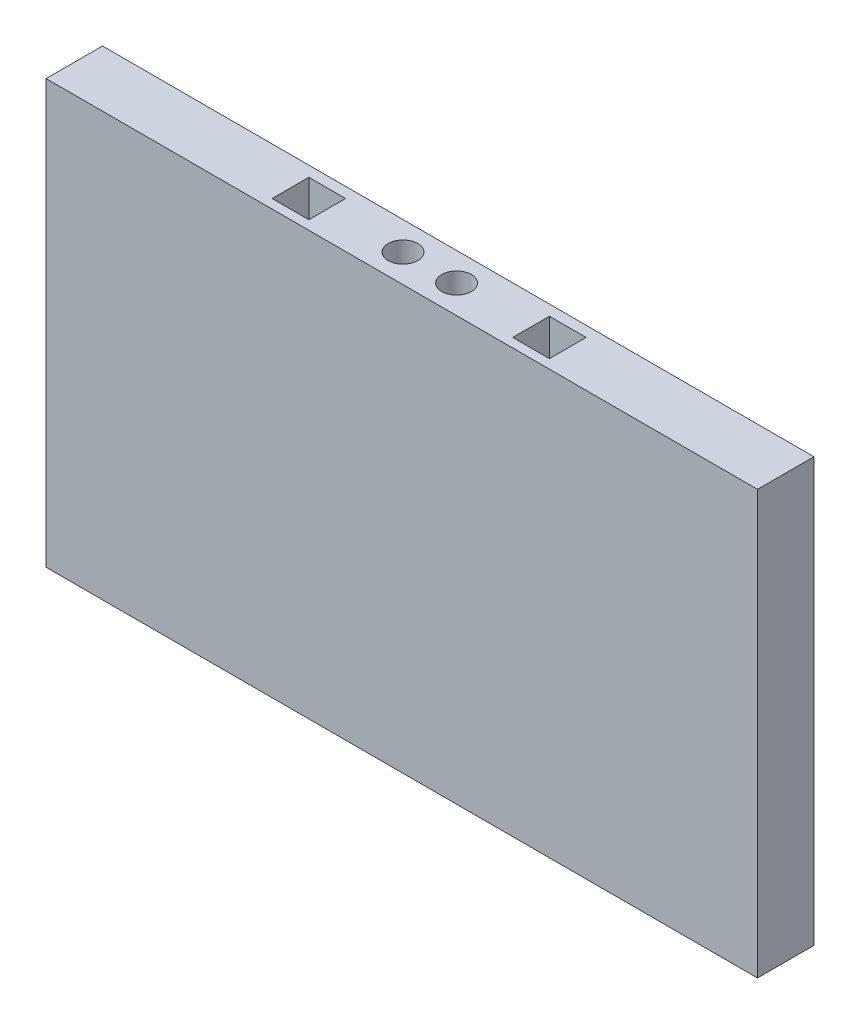
ISO-10303-21;
HEADER;
FILE_DESCRIPTION(('STEP AP214'),'2;1');
FILE_NAME('part.step','',(''),(''),'','','');
FILE_SCHEMA(('AUTOMOTIVE_DESIGN { 1 0 10303 214 1 1 1 1 }'));
ENDSEC;
DATA;
#1=APPLICATION_CONTEXT('core data for automotive mechanical design processes');
#2=APPLICATION_PROTOCOL_DEFINITION('international standard','automotive_design',2000,#1);
#3=PRODUCT_CONTEXT('',#1,'mechanical');
#4=PRODUCT('Part','Part','',(#3));
#5=PRODUCT_RELATED_PRODUCT_CATEGORY('part','',(#4));
#6=PRODUCT_DEFINITION_FORMATION('','',#4);
#7=PRODUCT_DEFINITION_CONTEXT('part definition',#1,'design');
#8=PRODUCT_DEFINITION('design','',#6,#7);
#9=PRODUCT_DEFINITION_SHAPE('','',#8);
#10=(LENGTH_UNIT() NAMED_UNIT(*) SI_UNIT(.MILLI.,.METRE.));
#11=(NAMED_UNIT(*) PLANE_ANGLE_UNIT() SI_UNIT($,.RADIAN.));
#12=(NAMED_UNIT(*) SI_UNIT($,.STERADIAN.) SOLID_ANGLE_UNIT());
#13=UNCERTAINTY_MEASURE_WITH_UNIT(LENGTH_MEASURE(1.E-05),#10,'distance_accuracy_value','');
#14=(GEOMETRIC_REPRESENTATION_CONTEXT(3) GLOBAL_UNCERTAINTY_ASSIGNED_CONTEXT((#13)) GLOBAL_UNIT_ASSIGNED_CONTEXT((#10,
#11,#12)) REPRESENTATION_CONTEXT('',''));
#15=CARTESIAN_POINT('',(0.,0.,0.));
#16=DIRECTION('',(0.,0.,1.));
#17=DIRECTION('',(1.,0.,0.));
#18=AXIS2_PLACEMENT_3D('',#15,#16,#17);
#19=CARTESIAN_POINT('',(-182.821386225128,92.090395480226,20.));
#20=DIRECTION('',(1.,0.,0.));
#21=DIRECTION('',(0.,0.,-1.));
#22=AXIS2_PLACEMENT_3D('',#19,#20,#21);
#23=PLANE('',#22);
#24=DIRECTION('',(0.,-1.,0.));
#25=VECTOR('',#24,1.);
#26=CARTESIAN_POINT('',(-182.821386225128,92.090395480226,0.));
#27=LINE('',#26,#25);
#28=CARTESIAN_POINT('',(-182.821386225128,92.090395480226,0.));
#29=VERTEX_POINT('',#28);
#30=CARTESIAN_POINT('',(-182.821386225128,-57.909604519774,0.));
#31=VERTEX_POINT('',#30);
#32=EDGE_CURVE('E217',#29,#31,#27,.T.);
#33=ORIENTED_EDGE('',*,*,#32,.T.);
#34=DIRECTION('',(0.,0.,1.));
#35=VECTOR('',#34,1.);
#36=CARTESIAN_POINT('',(-182.821386225128,-57.909604519774,-316.865902236261));
#37=LINE('',#36,#35);
#38=CARTESIAN_POINT('',(-182.821386225128,-57.909604519774,20.));
#39=VERTEX_POINT('',#38);
#40=EDGE_CURVE('E140',#31,#39,#37,.T.);
#41=ORIENTED_EDGE('',*,*,#40,.T.);
#42=DIRECTION('',(0.,-1.,0.));
#43=VECTOR('',#42,1.);
#44=CARTESIAN_POINT('',(-182.821386225128,92.090395480226,20.));
#45=LINE('',#44,#43);
#46=CARTESIAN_POINT('',(-182.821386225128,92.090395480226,20.));
#47=VERTEX_POINT('',#46);
#48=EDGE_CURVE('E39',#47,#39,#45,.T.);
#49=ORIENTED_EDGE('',*,*,#48,.F.);
#50=DIRECTION('',(0.,0.,-1.));
#51=VECTOR('',#50,1.);
#52=CARTESIAN_POINT('',(-182.821386225128,92.090395480226,20.));
#53=LINE('',#52,#51);
#54=EDGE_CURVE('E11',#47,#29,#53,.T.);
#55=ORIENTED_EDGE('',*,*,#54,.T.);
#56=EDGE_LOOP('',(#33,#41,#49,#55));
#57=FACE_BOUND('',#56,.T.);
#58=ADVANCED_FACE('F32',(#57),#23,.F.);
#59=CARTESIAN_POINT('',(-107.821386225128,92.090395480226,20.));
#60=DIRECTION('',(0.,-1.,0.));
#61=DIRECTION('',(1.,0.,0.));
#62=AXIS2_PLACEMENT_3D('',#59,#60,#61);
#63=PLANE('',#62);
#64=DIRECTION('',(-1.,0.,0.));
#65=VECTOR('',#64,1.);
#66=CARTESIAN_POINT('',(-7.66377731017402,92.090395480226,3.75));
#67=LINE('',#66,#65);
#68=CARTESIAN_POINT('',(-7.66377731017402,92.090395480226,3.75));
#69=VERTEX_POINT('',#68);
#70=CARTESIAN_POINT('',(-20.663777310174,92.090395480226,3.75));
#71=VERTEX_POINT('',#70);
#72=EDGE_CURVE('E142',#69,#71,#67,.T.);
#73=ORIENTED_EDGE('',*,*,#72,.F.);
#74=DIRECTION('',(0.,0.,-1.));
#75=VECTOR('',#74,1.);
#76=CARTESIAN_POINT('',(-7.66377731017402,92.090395480226,3.75));
#77=LINE('',#76,#75);
#78=CARTESIAN_POINT('',(-7.66377731017402,92.090395480226,16.75));
#79=VERTEX_POINT('',#78);
#80=EDGE_CURVE('E54',#79,#69,#77,.T.);
#81=ORIENTED_EDGE('',*,*,#80,.F.);
#82=DIRECTION('',(1.,0.,0.));
#83=VECTOR('',#82,1.);
#84=CARTESIAN_POINT('',(-7.66377731017402,92.090395480226,16.75));
#85=LINE('',#84,#83);
#86=CARTESIAN_POINT('',(-20.663777310174,92.090395480226,16.75));
#87=VERTEX_POINT('',#86);
#88=EDGE_CURVE('E151',#87,#79,#85,.T.);
#89=ORIENTED_EDGE('',*,*,#88,.F.);
#90=DIRECTION('',(0.,0.,1.));
#91=VECTOR('',#90,1.);
#92=CARTESIAN_POINT('',(-20.663777310174,92.090395480226,3.75));
#93=LINE('',#92,#91);
#94=EDGE_CURVE('E163',#71,#87,#93,.T.);
#95=ORIENTED_EDGE('',*,*,#94,.F.);
#96=EDGE_LOOP('',(#73,#81,#89,#95));
#97=FACE_BOUND('',#96,.T.);
#98=DIRECTION('',(1.,0.,0.));
#99=VECTOR('',#98,1.);
#100=CARTESIAN_POINT('',(-105.941386225128,92.090395480226,16.75));
#101=LINE('',#100,#99);
#102=CARTESIAN_POINT('',(-105.941386225128,92.090395480226,16.75));
#103=VERTEX_POINT('',#102);
#104=CARTESIAN_POINT('',(-92.9413862251281,92.090395480226,16.75));
#105=VERTEX_POINT('',#104);
#106=EDGE_CURVE('E191',#103,#105,#101,.T.);
#107=ORIENTED_EDGE('',*,*,#106,.F.);
#108=DIRECTION('',(0.,0.,1.));
#109=VECTOR('',#108,1.);
#110=CARTESIAN_POINT('',(-105.941386225128,92.090395480226,3.75));
#111=LINE('',#110,#109);
#112=CARTESIAN_POINT('',(-105.941386225128,92.090395480226,3.75));
#113=VERTEX_POINT('',#112);
#114=EDGE_CURVE('E170',#113,#103,#111,.T.);
#115=ORIENTED_EDGE('',*,*,#114,.F.);
#116=DIRECTION('',(-1.,0.,0.));
#117=VECTOR('',#116,1.);
#118=CARTESIAN_POINT('',(-105.941386225128,92.090395480226,3.75));
#119=LINE('',#118,#117);
#120=CARTESIAN_POINT('',(-92.9413862251281,92.090395480226,3.75));
#121=VERTEX_POINT('',#120);
#122=EDGE_CURVE('E180',#121,#113,#119,.T.);
#123=ORIENTED_EDGE('',*,*,#122,.F.);
#124=DIRECTION('',(0.,0.,-1.));
#125=VECTOR('',#124,1.);
#126=CARTESIAN_POINT('',(-92.9413862251281,92.090395480226,3.75));
#127=LINE('',#126,#125);
#128=EDGE_CURVE('E194',#105,#121,#127,.T.);
#129=ORIENTED_EDGE('',*,*,#128,.F.);
#130=EDGE_LOOP('',(#107,#115,#123,#129));
#131=FACE_BOUND('',#130,.T.);
#132=CARTESIAN_POINT('',(-47.3213862251281,92.090395480226,10.));
#133=DIRECTION('',(0.,1.,0.));
#134=DIRECTION('',(-1.,0.,0.));
#135=AXIS2_PLACEMENT_3D('',#132,#133,#134);
#136=CIRCLE('',#135,5.25);
#137=CARTESIAN_POINT('',(-52.5713862251281,92.090395480226,10.));
#138=VERTEX_POINT('',#137);
#139=EDGE_CURVE('E201',#138,#138,#136,.T.);
#140=ORIENTED_EDGE('',*,*,#139,.F.);
#141=EDGE_LOOP('',(#140));
#142=FACE_BOUND('',#141,.T.);
#143=CARTESIAN_POINT('',(-66.3213862251281,92.090395480226,10.));
#144=DIRECTION('',(0.,1.,0.));
#145=DIRECTION('',(-1.,0.,0.));
#146=AXIS2_PLACEMENT_3D('',#143,#144,#145);
#147=CIRCLE('',#146,5.25);
#148=CARTESIAN_POINT('',(-71.5713862251281,92.090395480226,10.));
#149=VERTEX_POINT('',#148);
#150=EDGE_CURVE('E211',#149,#149,#147,.T.);
#151=ORIENTED_EDGE('',*,*,#150,.F.);
#152=EDGE_LOOP('',(#151));
#153=FACE_BOUND('',#152,.T.);
#154=DIRECTION('',(-1.,0.,0.));
#155=VECTOR('',#154,1.);
#156=CARTESIAN_POINT('',(-107.821386225128,92.090395480226,20.));
#157=LINE('',#156,#155);
#158=CARTESIAN_POINT('',(69.336222689826,92.0903954802261,20.));
#159=VERTEX_POINT('',#158);
#160=EDGE_CURVE('E220',#159,#47,#157,.T.);
#161=ORIENTED_EDGE('',*,*,#160,.F.);
#162=DIRECTION('',(0.,0.,1.));
#163=VECTOR('',#162,1.);
#164=CARTESIAN_POINT('',(69.336222689826,92.0903954802261,20.));
#165=LINE('',#164,#163);
#166=CARTESIAN_POINT('',(69.336222689826,92.0903954802261,0.));
#167=VERTEX_POINT('',#166);
#168=EDGE_CURVE('E126',#167,#159,#165,.T.);
#169=ORIENTED_EDGE('',*,*,#168,.F.);
#170=DIRECTION('',(-1.,0.,0.));
#171=VECTOR('',#170,1.);
#172=CARTESIAN_POINT('',(-107.821386225128,92.090395480226,0.));
#173=LINE('',#172,#171);
#174=EDGE_CURVE('E134',#167,#29,#173,.T.);
#175=ORIENTED_EDGE('',*,*,#174,.T.);
#176=ORIENTED_EDGE('',*,*,#54,.F.);
#177=EDGE_LOOP('',(#161,#169,#175,#176));
#178=FACE_BOUND('',#177,.T.);
#179=ADVANCED_FACE('F226',(#97,#131,#142,#153,#178),#63,.F.);
#180=CARTESIAN_POINT('',(0.,0.,20.));
#181=DIRECTION('',(0.,0.,1.));
#182=DIRECTION('',(1.,0.,0.));
#183=AXIS2_PLACEMENT_3D('',#180,#181,#182);
#184=PLANE('',#183);
#185=DIRECTION('',(0.,1.,0.));
#186=VECTOR('',#185,1.);
#187=CARTESIAN_POINT('',(69.336222689826,-57.909604519774,20.));
#188=LINE('',#187,#186);
#189=CARTESIAN_POINT('',(69.3362226898259,-57.909604519774,20.));
#190=VERTEX_POINT('',#189);
#191=EDGE_CURVE('E46',#190,#159,#188,.T.);
#192=ORIENTED_EDGE('',*,*,#191,.T.);
#193=ORIENTED_EDGE('',*,*,#160,.T.);
#194=ORIENTED_EDGE('',*,*,#48,.T.);
#195=DIRECTION('',(1.,0.,0.));
#196=VECTOR('',#195,1.);
#197=CARTESIAN_POINT('',(-182.821386225128,-57.909604519774,20.));
#198=LINE('',#197,#196);
#199=EDGE_CURVE('E135',#39,#190,#198,.T.);
#200=ORIENTED_EDGE('',*,*,#199,.T.);
#201=EDGE_LOOP('',(#192,#193,#194,#200));
#202=FACE_BOUND('',#201,.T.);
#203=ADVANCED_FACE('F230',(#202),#184,.T.);
#204=CARTESIAN_POINT('',(0.,0.,0.));
#205=DIRECTION('',(0.,0.,1.));
#206=DIRECTION('',(1.,0.,0.));
#207=AXIS2_PLACEMENT_3D('',#204,#205,#206);
#208=PLANE('',#207);
#209=ORIENTED_EDGE('',*,*,#174,.F.);
#210=DIRECTION('',(0.,1.,0.));
#211=VECTOR('',#210,1.);
#212=CARTESIAN_POINT('',(69.336222689826,-57.909604519774,0.));
#213=LINE('',#212,#211);
#214=CARTESIAN_POINT('',(69.336222689826,-57.909604519774,0.));
#215=VERTEX_POINT('',#214);
#216=EDGE_CURVE('E120',#215,#167,#213,.T.);
#217=ORIENTED_EDGE('',*,*,#216,.F.);
#218=DIRECTION('',(-1.,0.,0.));
#219=VECTOR('',#218,1.);
#220=CARTESIAN_POINT('',(-182.821386225128,-57.909604519774,0.));
#221=LINE('',#220,#219);
#222=EDGE_CURVE('E132',#215,#31,#221,.T.);
#223=ORIENTED_EDGE('',*,*,#222,.T.);
#224=ORIENTED_EDGE('',*,*,#32,.F.);
#225=EDGE_LOOP('',(#209,#217,#223,#224));
#226=FACE_BOUND('',#225,.T.);
#227=ADVANCED_FACE('F130',(#226),#208,.F.);
#228=CARTESIAN_POINT('',(-66.3213862251281,72.090395480226,10.));
#229=DIRECTION('',(0.,1.,0.));
#230=DIRECTION('',(-1.,0.,0.));
#231=AXIS2_PLACEMENT_3D('',#228,#229,#230);
#232=CYLINDRICAL_SURFACE('',#231,5.25);
#233=CARTESIAN_POINT('',(-66.3213862251281,72.090395480226,10.));
#234=DIRECTION('',(0.,1.,0.));
#235=DIRECTION('',(-1.,0.,0.));
#236=AXIS2_PLACEMENT_3D('',#233,#234,#235);
#237=CIRCLE('',#236,5.25);
#238=CARTESIAN_POINT('',(-71.5713862251281,72.090395480226,10.));
#239=VERTEX_POINT('',#238);
#240=EDGE_CURVE('E214',#239,#239,#237,.T.);
#241=ORIENTED_EDGE('',*,*,#240,.F.);
#242=EDGE_LOOP('',(#241));
#243=FACE_BOUND('',#242,.T.);
#244=ORIENTED_EDGE('',*,*,#150,.T.);
#245=EDGE_LOOP('',(#244));
#246=FACE_BOUND('',#245,.T.);
#247=ADVANCED_FACE('F239',(#243,#246),#232,.F.);
#248=CARTESIAN_POINT('',(-66.3213862251281,72.090395480226,10.));
#249=DIRECTION('',(0.,1.,0.));
#250=DIRECTION('',(-1.,0.,0.));
#251=AXIS2_PLACEMENT_3D('',#248,#249,#250);
#252=PLANE('',#251);
#253=ORIENTED_EDGE('',*,*,#240,.T.);
#254=EDGE_LOOP('',(#253));
#255=FACE_BOUND('',#254,.T.);
#256=ADVANCED_FACE('F332',(#255),#252,.T.);
#257=CARTESIAN_POINT('',(-47.3213862251281,72.090395480226,10.));
#258=DIRECTION('',(0.,1.,0.));
#259=DIRECTION('',(-1.,0.,0.));
#260=AXIS2_PLACEMENT_3D('',#257,#258,#259);
#261=CYLINDRICAL_SURFACE('',#260,5.25);
#262=CARTESIAN_POINT('',(-47.3213862251281,72.090395480226,10.));
#263=DIRECTION('',(0.,1.,0.));
#264=DIRECTION('',(-1.,0.,0.));
#265=AXIS2_PLACEMENT_3D('',#262,#263,#264);
#266=CIRCLE('',#265,5.25);
#267=CARTESIAN_POINT('',(-52.5713862251281,72.090395480226,10.));
#268=VERTEX_POINT('',#267);
#269=EDGE_CURVE('E208',#268,#268,#266,.T.);
#270=ORIENTED_EDGE('',*,*,#269,.F.);
#271=EDGE_LOOP('',(#270));
#272=FACE_BOUND('',#271,.T.);
#273=ORIENTED_EDGE('',*,*,#139,.T.);
#274=EDGE_LOOP('',(#273));
#275=FACE_BOUND('',#274,.T.);
#276=ADVANCED_FACE('F328',(#272,#275),#261,.F.);
#277=CARTESIAN_POINT('',(-47.3213862251281,72.090395480226,10.));
#278=DIRECTION('',(0.,1.,0.));
#279=DIRECTION('',(-1.,0.,0.));
#280=AXIS2_PLACEMENT_3D('',#277,#278,#279);
#281=PLANE('',#280);
#282=ORIENTED_EDGE('',*,*,#269,.T.);
#283=EDGE_LOOP('',(#282));
#284=FACE_BOUND('',#283,.T.);
#285=ADVANCED_FACE('F324',(#284),#281,.T.);
#286=CARTESIAN_POINT('',(-105.941386225128,76.590395480226,3.75));
#287=DIRECTION('',(-1.,0.,0.));
#288=DIRECTION('',(0.,-1.,0.));
#289=AXIS2_PLACEMENT_3D('',#286,#287,#288);
#290=PLANE('',#289);
#291=ORIENTED_EDGE('',*,*,#114,.T.);
#292=DIRECTION('',(0.,1.,0.));
#293=VECTOR('',#292,1.);
#294=CARTESIAN_POINT('',(-105.941386225128,76.590395480226,16.75));
#295=LINE('',#294,#293);
#296=CARTESIAN_POINT('',(-105.941386225128,76.590395480226,16.75));
#297=VERTEX_POINT('',#296);
#298=EDGE_CURVE('E189',#297,#103,#295,.T.);
#299=ORIENTED_EDGE('',*,*,#298,.F.);
#300=DIRECTION('',(0.,0.,1.));
#301=VECTOR('',#300,1.);
#302=CARTESIAN_POINT('',(-105.941386225128,76.590395480226,3.75));
#303=LINE('',#302,#301);
#304=CARTESIAN_POINT('',(-105.941386225128,76.590395480226,3.75));
#305=VERTEX_POINT('',#304);
#306=EDGE_CURVE('E176',#305,#297,#303,.T.);
#307=ORIENTED_EDGE('',*,*,#306,.F.);
#308=DIRECTION('',(0.,1.,0.));
#309=VECTOR('',#308,1.);
#310=CARTESIAN_POINT('',(-105.941386225128,76.590395480226,3.75));
#311=LINE('',#310,#309);
#312=EDGE_CURVE('E199',#305,#113,#311,.T.);
#313=ORIENTED_EDGE('',*,*,#312,.T.);
#314=EDGE_LOOP('',(#291,#299,#307,#313));
#315=FACE_BOUND('',#314,.T.);
#316=ADVANCED_FACE('F314',(#315),#290,.F.);
#317=CARTESIAN_POINT('',(-105.941386225128,76.590395480226,3.75));
#318=DIRECTION('',(0.,0.,-1.));
#319=DIRECTION('',(-1.,0.,0.));
#320=AXIS2_PLACEMENT_3D('',#317,#318,#319);
#321=PLANE('',#320);
#322=ORIENTED_EDGE('',*,*,#122,.T.);
#323=ORIENTED_EDGE('',*,*,#312,.F.);
#324=DIRECTION('',(-1.,0.,0.));
#325=VECTOR('',#324,1.);
#326=CARTESIAN_POINT('',(-105.941386225128,76.590395480226,3.75));
#327=LINE('',#326,#325);
#328=CARTESIAN_POINT('',(-92.9413862251281,76.590395480226,3.75));
#329=VERTEX_POINT('',#328);
#330=EDGE_CURVE('E186',#329,#305,#327,.T.);
#331=ORIENTED_EDGE('',*,*,#330,.F.);
#332=DIRECTION('',(0.,1.,0.));
#333=VECTOR('',#332,1.);
#334=CARTESIAN_POINT('',(-92.9413862251281,76.590395480226,3.75));
#335=LINE('',#334,#333);
#336=EDGE_CURVE('E202',#329,#121,#335,.T.);
#337=ORIENTED_EDGE('',*,*,#336,.T.);
#338=EDGE_LOOP('',(#322,#323,#331,#337));
#339=FACE_BOUND('',#338,.T.);
#340=ADVANCED_FACE('F310',(#339),#321,.F.);
#341=CARTESIAN_POINT('',(-92.9413862251281,76.590395480226,3.75));
#342=DIRECTION('',(1.,0.,0.));
#343=DIRECTION('',(0.,1.,0.));
#344=AXIS2_PLACEMENT_3D('',#341,#342,#343);
#345=PLANE('',#344);
#346=ORIENTED_EDGE('',*,*,#128,.T.);
#347=ORIENTED_EDGE('',*,*,#336,.F.);
#348=DIRECTION('',(0.,0.,-1.));
#349=VECTOR('',#348,1.);
#350=CARTESIAN_POINT('',(-92.9413862251281,76.590395480226,3.75));
#351=LINE('',#350,#349);
#352=CARTESIAN_POINT('',(-92.9413862251281,76.590395480226,16.75));
#353=VERTEX_POINT('',#352);
#354=EDGE_CURVE('E183',#353,#329,#351,.T.);
#355=ORIENTED_EDGE('',*,*,#354,.F.);
#356=DIRECTION('',(0.,1.,0.));
#357=VECTOR('',#356,1.);
#358=CARTESIAN_POINT('',(-92.9413862251281,76.590395480226,16.75));
#359=LINE('',#358,#357);
#360=EDGE_CURVE('E204',#353,#105,#359,.T.);
#361=ORIENTED_EDGE('',*,*,#360,.T.);
#362=EDGE_LOOP('',(#346,#347,#355,#361));
#363=FACE_BOUND('',#362,.T.);
#364=ADVANCED_FACE('F313',(#363),#345,.F.);
#365=CARTESIAN_POINT('',(-105.941386225128,76.590395480226,16.75));
#366=DIRECTION('',(0.,0.,1.));
#367=DIRECTION('',(1.,0.,0.));
#368=AXIS2_PLACEMENT_3D('',#365,#366,#367);
#369=PLANE('',#368);
#370=ORIENTED_EDGE('',*,*,#106,.T.);
#371=ORIENTED_EDGE('',*,*,#360,.F.);
#372=DIRECTION('',(1.,0.,0.));
#373=VECTOR('',#372,1.);
#374=CARTESIAN_POINT('',(-105.941386225128,76.590395480226,16.75));
#375=LINE('',#374,#373);
#376=EDGE_CURVE('E179',#297,#353,#375,.T.);
#377=ORIENTED_EDGE('',*,*,#376,.F.);
#378=ORIENTED_EDGE('',*,*,#298,.T.);
#379=EDGE_LOOP('',(#370,#371,#377,#378));
#380=FACE_BOUND('',#379,.T.);
#381=ADVANCED_FACE('F308',(#380),#369,.F.);
#382=CARTESIAN_POINT('',(0.,76.590395480226,0.));
#383=DIRECTION('',(0.,1.,0.));
#384=DIRECTION('',(0.,0.,1.));
#385=AXIS2_PLACEMENT_3D('',#382,#383,#384);
#386=PLANE('',#385);
#387=ORIENTED_EDGE('',*,*,#306,.T.);
#388=ORIENTED_EDGE('',*,*,#376,.T.);
#389=ORIENTED_EDGE('',*,*,#354,.T.);
#390=ORIENTED_EDGE('',*,*,#330,.T.);
#391=EDGE_LOOP('',(#387,#388,#389,#390));
#392=FACE_BOUND('',#391,.T.);
#393=ADVANCED_FACE('F305',(#392),#386,.T.);
#394=CARTESIAN_POINT('',(-7.66377731017401,76.590395480226,3.75));
#395=DIRECTION('',(1.,0.,0.));
#396=DIRECTION('',(0.,1.,0.));
#397=AXIS2_PLACEMENT_3D('',#394,#395,#396);
#398=PLANE('',#397);
#399=ORIENTED_EDGE('',*,*,#80,.T.);
#400=DIRECTION('',(0.,1.,0.));
#401=VECTOR('',#400,1.);
#402=CARTESIAN_POINT('',(-7.66377731017401,76.590395480226,3.75));
#403=LINE('',#402,#401);
#404=CARTESIAN_POINT('',(-7.66377731017401,76.590395480226,3.75));
#405=VERTEX_POINT('',#404);
#406=EDGE_CURVE('E159',#405,#69,#403,.T.);
#407=ORIENTED_EDGE('',*,*,#406,.F.);
#408=DIRECTION('',(0.,0.,-1.));
#409=VECTOR('',#408,1.);
#410=CARTESIAN_POINT('',(-7.66377731017401,76.590395480226,3.75));
#411=LINE('',#410,#409);
#412=CARTESIAN_POINT('',(-7.66377731017401,76.590395480226,16.75));
#413=VERTEX_POINT('',#412);
#414=EDGE_CURVE('E147',#413,#405,#411,.T.);
#415=ORIENTED_EDGE('',*,*,#414,.F.);
#416=DIRECTION('',(0.,1.,0.));
#417=VECTOR('',#416,1.);
#418=CARTESIAN_POINT('',(-7.66377731017401,76.590395480226,16.75));
#419=LINE('',#418,#417);
#420=EDGE_CURVE('E168',#413,#79,#419,.T.);
#421=ORIENTED_EDGE('',*,*,#420,.T.);
#422=EDGE_LOOP('',(#399,#407,#415,#421));
#423=FACE_BOUND('',#422,.T.);
#424=ADVANCED_FACE('F295',(#423),#398,.F.);
#425=CARTESIAN_POINT('',(-7.66377731017401,76.590395480226,16.75));
#426=DIRECTION('',(0.,0.,1.));
#427=DIRECTION('',(1.,0.,0.));
#428=AXIS2_PLACEMENT_3D('',#425,#426,#427);
#429=PLANE('',#428);
#430=ORIENTED_EDGE('',*,*,#88,.T.);
#431=ORIENTED_EDGE('',*,*,#420,.F.);
#432=DIRECTION('',(1.,0.,0.));
#433=VECTOR('',#432,1.);
#434=CARTESIAN_POINT('',(-7.66377731017401,76.590395480226,16.75));
#435=LINE('',#434,#433);
#436=CARTESIAN_POINT('',(-20.663777310174,76.590395480226,16.75));
#437=VERTEX_POINT('',#436);
#438=EDGE_CURVE('E157',#437,#413,#435,.T.);
#439=ORIENTED_EDGE('',*,*,#438,.F.);
#440=DIRECTION('',(0.,1.,0.));
#441=VECTOR('',#440,1.);
#442=CARTESIAN_POINT('',(-20.663777310174,76.590395480226,16.75));
#443=LINE('',#442,#441);
#444=EDGE_CURVE('E171',#437,#87,#443,.T.);
#445=ORIENTED_EDGE('',*,*,#444,.T.);
#446=EDGE_LOOP('',(#430,#431,#439,#445));
#447=FACE_BOUND('',#446,.T.);
#448=ADVANCED_FACE('F291',(#447),#429,.F.);
#449=CARTESIAN_POINT('',(-20.663777310174,76.590395480226,3.75));
#450=DIRECTION('',(-1.,0.,0.));
#451=DIRECTION('',(0.,-1.,0.));
#452=AXIS2_PLACEMENT_3D('',#449,#450,#451);
#453=PLANE('',#452);
#454=ORIENTED_EDGE('',*,*,#94,.T.);
#455=ORIENTED_EDGE('',*,*,#444,.F.);
#456=DIRECTION('',(0.,0.,1.));
#457=VECTOR('',#456,1.);
#458=CARTESIAN_POINT('',(-20.663777310174,76.590395480226,3.75));
#459=LINE('',#458,#457);
#460=CARTESIAN_POINT('',(-20.663777310174,76.590395480226,3.75));
#461=VERTEX_POINT('',#460);
#462=EDGE_CURVE('E154',#461,#437,#459,.T.);
#463=ORIENTED_EDGE('',*,*,#462,.F.);
#464=DIRECTION('',(0.,1.,0.));
#465=VECTOR('',#464,1.);
#466=CARTESIAN_POINT('',(-20.663777310174,76.590395480226,3.75));
#467=LINE('',#466,#465);
#468=EDGE_CURVE('E173',#461,#71,#467,.T.);
#469=ORIENTED_EDGE('',*,*,#468,.T.);
#470=EDGE_LOOP('',(#454,#455,#463,#469));
#471=FACE_BOUND('',#470,.T.);
#472=ADVANCED_FACE('F294',(#471),#453,.F.);
#473=CARTESIAN_POINT('',(-7.66377731017401,76.590395480226,3.75));
#474=DIRECTION('',(0.,0.,-1.));
#475=DIRECTION('',(-1.,0.,0.));
#476=AXIS2_PLACEMENT_3D('',#473,#474,#475);
#477=PLANE('',#476);
#478=ORIENTED_EDGE('',*,*,#72,.T.);
#479=ORIENTED_EDGE('',*,*,#468,.F.);
#480=DIRECTION('',(-1.,0.,0.));
#481=VECTOR('',#480,1.);
#482=CARTESIAN_POINT('',(-7.66377731017401,76.590395480226,3.75));
#483=LINE('',#482,#481);
#484=EDGE_CURVE('E150',#405,#461,#483,.T.);
#485=ORIENTED_EDGE('',*,*,#484,.F.);
#486=ORIENTED_EDGE('',*,*,#406,.T.);
#487=EDGE_LOOP('',(#478,#479,#485,#486));
#488=FACE_BOUND('',#487,.T.);
#489=ADVANCED_FACE('F289',(#488),#477,.F.);
#490=CARTESIAN_POINT('',(0.,76.590395480226,0.));
#491=DIRECTION('',(0.,-1.,0.));
#492=DIRECTION('',(0.,0.,-1.));
#493=AXIS2_PLACEMENT_3D('',#490,#491,#492);
#494=PLANE('',#493);
#495=ORIENTED_EDGE('',*,*,#414,.T.);
#496=ORIENTED_EDGE('',*,*,#484,.T.);
#497=ORIENTED_EDGE('',*,*,#462,.T.);
#498=ORIENTED_EDGE('',*,*,#438,.T.);
#499=EDGE_LOOP('',(#495,#496,#497,#498));
#500=FACE_BOUND('',#499,.T.);
#501=ADVANCED_FACE('F274',(#500),#494,.F.);
#502=CARTESIAN_POINT('',(-182.821386225128,-57.909604519774,-316.865902236261));
#503=DIRECTION('',(0.,-1.,0.));
#504=DIRECTION('',(0.,0.,-1.));
#505=AXIS2_PLACEMENT_3D('',#502,#503,#504);
#506=PLANE('',#505);
#507=DIRECTION('',(0.,0.,1.));
#508=VECTOR('',#507,1.);
#509=CARTESIAN_POINT('',(69.336222689826,-57.909604519774,20.));
#510=LINE('',#509,#508);
#511=EDGE_CURVE('E117',#215,#190,#510,.T.);
#512=ORIENTED_EDGE('',*,*,#511,.T.);
#513=ORIENTED_EDGE('',*,*,#199,.F.);
#514=ORIENTED_EDGE('',*,*,#40,.F.);
#515=ORIENTED_EDGE('',*,*,#222,.F.);
#516=EDGE_LOOP('',(#512,#513,#514,#515));
#517=FACE_BOUND('',#516,.T.);
#518=ADVANCED_FACE('F138',(#517),#506,.T.);
#519=CARTESIAN_POINT('',(69.336222689826,-57.909604519774,20.));
#520=DIRECTION('',(-1.,0.,0.));
#521=DIRECTION('',(0.,-1.,0.));
#522=AXIS2_PLACEMENT_3D('',#519,#520,#521);
#523=PLANE('',#522);
#524=ORIENTED_EDGE('',*,*,#168,.T.);
#525=ORIENTED_EDGE('',*,*,#191,.F.);
#526=ORIENTED_EDGE('',*,*,#511,.F.);
#527=ORIENTED_EDGE('',*,*,#216,.T.);
#528=EDGE_LOOP('',(#524,#525,#526,#527));
#529=FACE_BOUND('',#528,.T.);
#530=ADVANCED_FACE('F119',(#529),#523,.F.);
#531=CLOSED_SHELL('',(#58,#179,#203,#227,#247,#256,#276,#285,#316,#340,#364,#381,#393,#424,#448,
#472,#489,#501,#518,#530));
#532=MANIFOLD_SOLID_BREP('B2',#531);
#533=ADVANCED_BREP_SHAPE_REPRESENTATION('',(#18,#532),#14);
#534=SHAPE_DEFINITION_REPRESENTATION(#9,#533);
ENDSEC;
END-ISO-10303-21;
